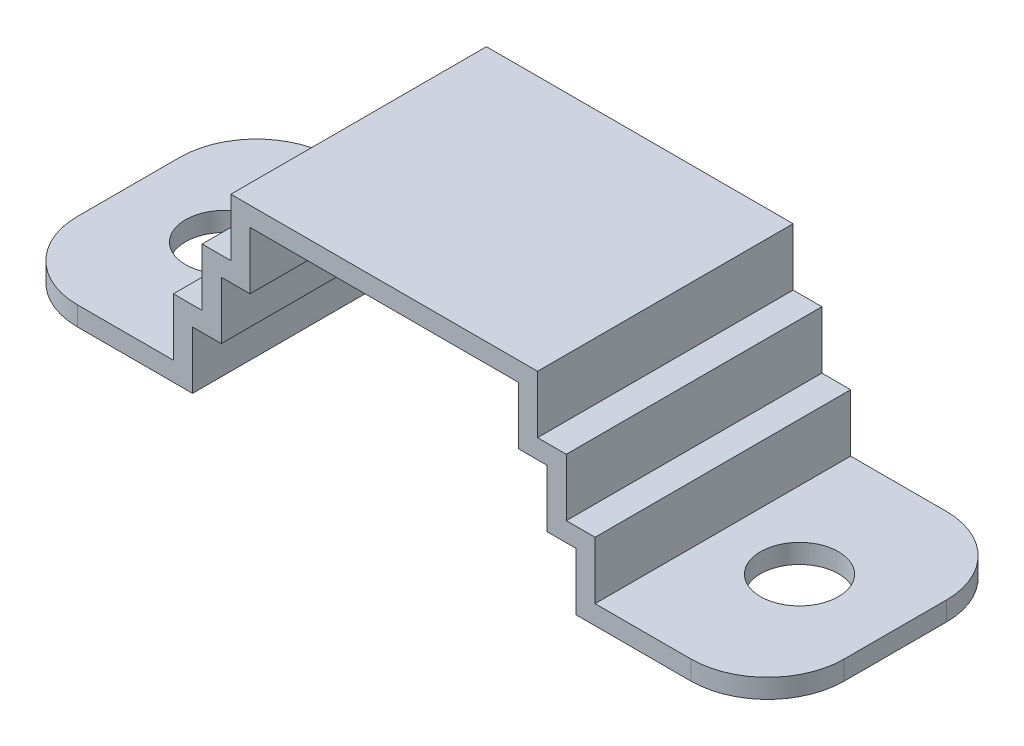
ISO-10303-21;
HEADER;
FILE_DESCRIPTION(('STEP AP214'),'2;1');
FILE_NAME('part.step','',(''),(''),'','','');
FILE_SCHEMA(('AUTOMOTIVE_DESIGN { 1 0 10303 214 1 1 1 1 }'));
ENDSEC;
DATA;
#1=APPLICATION_CONTEXT('core data for automotive mechanical design processes');
#2=APPLICATION_PROTOCOL_DEFINITION('international standard','automotive_design',2000,#1);
#3=PRODUCT_CONTEXT('',#1,'mechanical');
#4=PRODUCT('Part','Part','',(#3));
#5=PRODUCT_RELATED_PRODUCT_CATEGORY('part','',(#4));
#6=PRODUCT_DEFINITION_FORMATION('','',#4);
#7=PRODUCT_DEFINITION_CONTEXT('part definition',#1,'design');
#8=PRODUCT_DEFINITION('design','',#6,#7);
#9=PRODUCT_DEFINITION_SHAPE('','',#8);
#10=(LENGTH_UNIT() NAMED_UNIT(*) SI_UNIT(.MILLI.,.METRE.));
#11=(NAMED_UNIT(*) PLANE_ANGLE_UNIT() SI_UNIT($,.RADIAN.));
#12=(NAMED_UNIT(*) SI_UNIT($,.STERADIAN.) SOLID_ANGLE_UNIT());
#13=UNCERTAINTY_MEASURE_WITH_UNIT(LENGTH_MEASURE(1.E-05),#10,'distance_accuracy_value','');
#14=(GEOMETRIC_REPRESENTATION_CONTEXT(3) GLOBAL_UNCERTAINTY_ASSIGNED_CONTEXT((#13)) GLOBAL_UNIT_ASSIGNED_CONTEXT((#10,
#11,#12)) REPRESENTATION_CONTEXT('',''));
#15=CARTESIAN_POINT('',(0.,0.,0.));
#16=DIRECTION('',(0.,0.,1.));
#17=DIRECTION('',(1.,0.,0.));
#18=AXIS2_PLACEMENT_3D('',#15,#16,#17);
#19=CARTESIAN_POINT('',(-21.,27.,-20.));
#20=DIRECTION('',(0.,-1.,0.));
#21=DIRECTION('',(0.,0.,-1.));
#22=AXIS2_PLACEMENT_3D('',#19,#20,#21);
#23=PLANE('',#22);
#24=DIRECTION('',(1.,0.,0.));
#25=VECTOR('',#24,1.);
#26=CARTESIAN_POINT('',(-21.,27.,20.));
#27=LINE('',#26,#25);
#28=CARTESIAN_POINT('',(-21.,27.,20.));
#29=VERTEX_POINT('',#28);
#30=CARTESIAN_POINT('',(21.,27.,20.));
#31=VERTEX_POINT('',#30);
#32=EDGE_CURVE('E338',#29,#31,#27,.T.);
#33=ORIENTED_EDGE('',*,*,#32,.F.);
#34=DIRECTION('',(0.,0.,1.));
#35=VECTOR('',#34,1.);
#36=CARTESIAN_POINT('',(-21.,27.,-20.));
#37=LINE('',#36,#35);
#38=CARTESIAN_POINT('',(-21.,27.,-20.));
#39=VERTEX_POINT('',#38);
#40=EDGE_CURVE('E258',#39,#29,#37,.T.);
#41=ORIENTED_EDGE('',*,*,#40,.F.);
#42=DIRECTION('',(1.,0.,0.));
#43=VECTOR('',#42,1.);
#44=CARTESIAN_POINT('',(-21.,27.,-20.));
#45=LINE('',#44,#43);
#46=CARTESIAN_POINT('',(21.,27.,-20.));
#47=VERTEX_POINT('',#46);
#48=EDGE_CURVE('E253',#39,#47,#45,.T.);
#49=ORIENTED_EDGE('',*,*,#48,.T.);
#50=DIRECTION('',(0.,0.,1.));
#51=VECTOR('',#50,1.);
#52=CARTESIAN_POINT('',(21.,27.,-20.));
#53=LINE('',#52,#51);
#54=EDGE_CURVE('E257',#47,#31,#53,.T.);
#55=ORIENTED_EDGE('',*,*,#54,.T.);
#56=EDGE_LOOP('',(#33,#41,#49,#55));
#57=FACE_BOUND('',#56,.T.);
#58=ADVANCED_FACE('F42',(#57),#23,.T.);
#59=CARTESIAN_POINT('',(-21.,18.,-20.));
#60=DIRECTION('',(1.,0.,0.));
#61=DIRECTION('',(0.,0.,-1.));
#62=AXIS2_PLACEMENT_3D('',#59,#60,#61);
#63=PLANE('',#62);
#64=DIRECTION('',(0.,1.,0.));
#65=VECTOR('',#64,1.);
#66=CARTESIAN_POINT('',(-21.,18.,20.));
#67=LINE('',#66,#65);
#68=CARTESIAN_POINT('',(-21.,18.,20.));
#69=VERTEX_POINT('',#68);
#70=EDGE_CURVE('E264',#69,#29,#67,.T.);
#71=ORIENTED_EDGE('',*,*,#70,.F.);
#72=DIRECTION('',(0.,0.,1.));
#73=VECTOR('',#72,1.);
#74=CARTESIAN_POINT('',(-21.,18.,-20.));
#75=LINE('',#74,#73);
#76=CARTESIAN_POINT('',(-21.,18.,-20.));
#77=VERTEX_POINT('',#76);
#78=EDGE_CURVE('E388',#77,#69,#75,.T.);
#79=ORIENTED_EDGE('',*,*,#78,.F.);
#80=DIRECTION('',(0.,1.,0.));
#81=VECTOR('',#80,1.);
#82=CARTESIAN_POINT('',(-21.,18.,-20.));
#83=LINE('',#82,#81);
#84=EDGE_CURVE('E334',#77,#39,#83,.T.);
#85=ORIENTED_EDGE('',*,*,#84,.T.);
#86=ORIENTED_EDGE('',*,*,#40,.T.);
#87=EDGE_LOOP('',(#71,#79,#85,#86));
#88=FACE_BOUND('',#87,.T.);
#89=ADVANCED_FACE('F694',(#88),#63,.T.);
#90=CARTESIAN_POINT('',(-25.5,18.,-20.));
#91=DIRECTION('',(0.,-1.,0.));
#92=DIRECTION('',(0.,0.,-1.));
#93=AXIS2_PLACEMENT_3D('',#90,#91,#92);
#94=PLANE('',#93);
#95=DIRECTION('',(1.,0.,0.));
#96=VECTOR('',#95,1.);
#97=CARTESIAN_POINT('',(-25.5,18.,20.));
#98=LINE('',#97,#96);
#99=CARTESIAN_POINT('',(-25.5,18.,20.));
#100=VERTEX_POINT('',#99);
#101=EDGE_CURVE('E378',#100,#69,#98,.T.);
#102=ORIENTED_EDGE('',*,*,#101,.F.);
#103=DIRECTION('',(0.,0.,1.));
#104=VECTOR('',#103,1.);
#105=CARTESIAN_POINT('',(-25.5,18.,-20.));
#106=LINE('',#105,#104);
#107=CARTESIAN_POINT('',(-25.5,18.,-20.));
#108=VERTEX_POINT('',#107);
#109=EDGE_CURVE('E391',#108,#100,#106,.T.);
#110=ORIENTED_EDGE('',*,*,#109,.F.);
#111=DIRECTION('',(1.,0.,0.));
#112=VECTOR('',#111,1.);
#113=CARTESIAN_POINT('',(-25.5,18.,-20.));
#114=LINE('',#113,#112);
#115=EDGE_CURVE('E330',#108,#77,#114,.T.);
#116=ORIENTED_EDGE('',*,*,#115,.T.);
#117=ORIENTED_EDGE('',*,*,#78,.T.);
#118=EDGE_LOOP('',(#102,#110,#116,#117));
#119=FACE_BOUND('',#118,.T.);
#120=ADVANCED_FACE('F691',(#119),#94,.T.);
#121=CARTESIAN_POINT('',(-25.5,9.,-20.));
#122=DIRECTION('',(1.,0.,0.));
#123=DIRECTION('',(0.,0.,-1.));
#124=AXIS2_PLACEMENT_3D('',#121,#122,#123);
#125=PLANE('',#124);
#126=DIRECTION('',(0.,1.,0.));
#127=VECTOR('',#126,1.);
#128=CARTESIAN_POINT('',(-25.5,9.,20.));
#129=LINE('',#128,#127);
#130=CARTESIAN_POINT('',(-25.5,9.,20.));
#131=VERTEX_POINT('',#130);
#132=EDGE_CURVE('E374',#131,#100,#129,.T.);
#133=ORIENTED_EDGE('',*,*,#132,.F.);
#134=DIRECTION('',(0.,0.,1.));
#135=VECTOR('',#134,1.);
#136=CARTESIAN_POINT('',(-25.5,9.,-20.));
#137=LINE('',#136,#135);
#138=CARTESIAN_POINT('',(-25.5,9.,-20.));
#139=VERTEX_POINT('',#138);
#140=EDGE_CURVE('E394',#139,#131,#137,.T.);
#141=ORIENTED_EDGE('',*,*,#140,.F.);
#142=DIRECTION('',(0.,1.,0.));
#143=VECTOR('',#142,1.);
#144=CARTESIAN_POINT('',(-25.5,9.,-20.));
#145=LINE('',#144,#143);
#146=EDGE_CURVE('E326',#139,#108,#145,.T.);
#147=ORIENTED_EDGE('',*,*,#146,.T.);
#148=ORIENTED_EDGE('',*,*,#109,.T.);
#149=EDGE_LOOP('',(#133,#141,#147,#148));
#150=FACE_BOUND('',#149,.T.);
#151=ADVANCED_FACE('F687',(#150),#125,.T.);
#152=CARTESIAN_POINT('',(-30.,9.,-20.));
#153=DIRECTION('',(0.,-1.,0.));
#154=DIRECTION('',(0.,0.,-1.));
#155=AXIS2_PLACEMENT_3D('',#152,#153,#154);
#156=PLANE('',#155);
#157=DIRECTION('',(1.,0.,0.));
#158=VECTOR('',#157,1.);
#159=CARTESIAN_POINT('',(-30.,9.,20.));
#160=LINE('',#159,#158);
#161=CARTESIAN_POINT('',(-30.,9.,20.));
#162=VERTEX_POINT('',#161);
#163=EDGE_CURVE('E370',#162,#131,#160,.T.);
#164=ORIENTED_EDGE('',*,*,#163,.F.);
#165=DIRECTION('',(0.,0.,1.));
#166=VECTOR('',#165,1.);
#167=CARTESIAN_POINT('',(-30.,9.,-20.));
#168=LINE('',#167,#166);
#169=CARTESIAN_POINT('',(-30.,9.,-20.));
#170=VERTEX_POINT('',#169);
#171=EDGE_CURVE('E397',#170,#162,#168,.T.);
#172=ORIENTED_EDGE('',*,*,#171,.F.);
#173=DIRECTION('',(1.,0.,0.));
#174=VECTOR('',#173,1.);
#175=CARTESIAN_POINT('',(-30.,9.,-20.));
#176=LINE('',#175,#174);
#177=EDGE_CURVE('E322',#170,#139,#176,.T.);
#178=ORIENTED_EDGE('',*,*,#177,.T.);
#179=ORIENTED_EDGE('',*,*,#140,.T.);
#180=EDGE_LOOP('',(#164,#172,#178,#179));
#181=FACE_BOUND('',#180,.T.);
#182=ADVANCED_FACE('F684',(#181),#156,.T.);
#183=CARTESIAN_POINT('',(-30.,0.,-20.));
#184=DIRECTION('',(1.,0.,0.));
#185=DIRECTION('',(0.,0.,-1.));
#186=AXIS2_PLACEMENT_3D('',#183,#184,#185);
#187=PLANE('',#186);
#188=DIRECTION('',(0.,1.,0.));
#189=VECTOR('',#188,1.);
#190=CARTESIAN_POINT('',(-30.,0.,20.));
#191=LINE('',#190,#189);
#192=CARTESIAN_POINT('',(-30.,0.,20.));
#193=VERTEX_POINT('',#192);
#194=EDGE_CURVE('E366',#193,#162,#191,.T.);
#195=ORIENTED_EDGE('',*,*,#194,.F.);
#196=DIRECTION('',(0.,0.,1.));
#197=VECTOR('',#196,1.);
#198=CARTESIAN_POINT('',(-30.,0.,-20.));
#199=LINE('',#198,#197);
#200=CARTESIAN_POINT('',(-30.,0.,-20.));
#201=VERTEX_POINT('',#200);
#202=EDGE_CURVE('E400',#201,#193,#199,.T.);
#203=ORIENTED_EDGE('',*,*,#202,.F.);
#204=DIRECTION('',(0.,1.,0.));
#205=VECTOR('',#204,1.);
#206=CARTESIAN_POINT('',(-30.,0.,-20.));
#207=LINE('',#206,#205);
#208=EDGE_CURVE('E318',#201,#170,#207,.T.);
#209=ORIENTED_EDGE('',*,*,#208,.T.);
#210=ORIENTED_EDGE('',*,*,#171,.T.);
#211=EDGE_LOOP('',(#195,#203,#209,#210));
#212=FACE_BOUND('',#211,.T.);
#213=ADVANCED_FACE('F680',(#212),#187,.T.);
#214=CARTESIAN_POINT('',(-60.,0.,-20.));
#215=DIRECTION('',(0.,-1.,0.));
#216=DIRECTION('',(0.,0.,-1.));
#217=AXIS2_PLACEMENT_3D('',#214,#215,#216);
#218=PLANE('',#217);
#219=CARTESIAN_POINT('',(-45.,0.,0.));
#220=DIRECTION('',(0.,1.,0.));
#221=DIRECTION('',(0.,0.,1.));
#222=AXIS2_PLACEMENT_3D('',#219,#220,#221);
#223=CIRCLE('',#222,6.1);
#224=CARTESIAN_POINT('',(-45.,0.,6.1));
#225=VERTEX_POINT('',#224);
#226=EDGE_CURVE('E541',#225,#225,#223,.T.);
#227=ORIENTED_EDGE('',*,*,#226,.T.);
#228=EDGE_LOOP('',(#227));
#229=FACE_BOUND('',#228,.T.);
#230=DIRECTION('',(0.,0.,1.));
#231=VECTOR('',#230,1.);
#232=CARTESIAN_POINT('',(-60.,0.,-20.));
#233=LINE('',#232,#231);
#234=CARTESIAN_POINT('',(-60.,0.,-8.));
#235=VERTEX_POINT('',#234);
#236=CARTESIAN_POINT('',(-60.,0.,8.));
#237=VERTEX_POINT('',#236);
#238=EDGE_CURVE('E404',#235,#237,#233,.T.);
#239=ORIENTED_EDGE('',*,*,#238,.F.);
#240=CARTESIAN_POINT('',(-48.,0.,-8.));
#241=DIRECTION('',(0.,-1.,0.));
#242=DIRECTION('',(0.,0.,-1.));
#243=AXIS2_PLACEMENT_3D('',#240,#241,#242);
#244=CIRCLE('',#243,12.);
#245=CARTESIAN_POINT('',(-48.,0.,-20.));
#246=VERTEX_POINT('',#245);
#247=EDGE_CURVE('E457',#235,#246,#244,.T.);
#248=ORIENTED_EDGE('',*,*,#247,.T.);
#249=DIRECTION('',(1.,0.,0.));
#250=VECTOR('',#249,1.);
#251=CARTESIAN_POINT('',(-60.,0.,-20.));
#252=LINE('',#251,#250);
#253=EDGE_CURVE('E315',#246,#201,#252,.T.);
#254=ORIENTED_EDGE('',*,*,#253,.T.);
#255=ORIENTED_EDGE('',*,*,#202,.T.);
#256=DIRECTION('',(1.,0.,0.));
#257=VECTOR('',#256,1.);
#258=CARTESIAN_POINT('',(-60.,0.,20.));
#259=LINE('',#258,#257);
#260=CARTESIAN_POINT('',(-48.,0.,20.));
#261=VERTEX_POINT('',#260);
#262=EDGE_CURVE('E363',#261,#193,#259,.T.);
#263=ORIENTED_EDGE('',*,*,#262,.F.);
#264=CARTESIAN_POINT('',(-48.,0.,8.));
#265=DIRECTION('',(0.,-1.,0.));
#266=DIRECTION('',(0.,0.,-1.));
#267=AXIS2_PLACEMENT_3D('',#264,#265,#266);
#268=CIRCLE('',#267,12.);
#269=EDGE_CURVE('E454',#261,#237,#268,.T.);
#270=ORIENTED_EDGE('',*,*,#269,.T.);
#271=EDGE_LOOP('',(#239,#248,#254,#255,#263,#270));
#272=FACE_BOUND('',#271,.T.);
#273=ADVANCED_FACE('F670',(#229,#272),#218,.T.);
#274=CARTESIAN_POINT('',(-60.,0.,-20.));
#275=DIRECTION('',(1.,0.,0.));
#276=DIRECTION('',(0.,0.,-1.));
#277=AXIS2_PLACEMENT_3D('',#274,#275,#276);
#278=PLANE('',#277);
#279=DIRECTION('',(0.,0.,1.));
#280=VECTOR('',#279,1.);
#281=CARTESIAN_POINT('',(-60.,3.,-20.));
#282=LINE('',#281,#280);
#283=CARTESIAN_POINT('',(-60.,3.,-8.));
#284=VERTEX_POINT('',#283);
#285=CARTESIAN_POINT('',(-60.,3.,8.));
#286=VERTEX_POINT('',#285);
#287=EDGE_CURVE('E408',#284,#286,#282,.T.);
#288=ORIENTED_EDGE('',*,*,#287,.F.);
#289=DIRECTION('',(0.,1.,0.));
#290=VECTOR('',#289,1.);
#291=CARTESIAN_POINT('',(-60.,0.,-8.));
#292=LINE('',#291,#290);
#293=EDGE_CURVE('E451',#284,#235,#292,.F.);
#294=ORIENTED_EDGE('',*,*,#293,.T.);
#295=ORIENTED_EDGE('',*,*,#238,.T.);
#296=DIRECTION('',(0.,1.,0.));
#297=VECTOR('',#296,1.);
#298=CARTESIAN_POINT('',(-60.,0.,8.));
#299=LINE('',#298,#297);
#300=EDGE_CURVE('E447',#237,#286,#299,.T.);
#301=ORIENTED_EDGE('',*,*,#300,.T.);
#302=EDGE_LOOP('',(#288,#294,#295,#301));
#303=FACE_BOUND('',#302,.T.);
#304=ADVANCED_FACE('F665',(#303),#278,.F.);
#305=CARTESIAN_POINT('',(-60.,3.,-20.));
#306=DIRECTION('',(0.,-1.,0.));
#307=DIRECTION('',(0.,0.,-1.));
#308=AXIS2_PLACEMENT_3D('',#305,#306,#307);
#309=PLANE('',#308);
#310=CARTESIAN_POINT('',(-45.,3.,0.));
#311=DIRECTION('',(0.,1.,0.));
#312=DIRECTION('',(0.,0.,1.));
#313=AXIS2_PLACEMENT_3D('',#310,#311,#312);
#314=CIRCLE('',#313,6.1);
#315=CARTESIAN_POINT('',(-45.,3.,6.1));
#316=VERTEX_POINT('',#315);
#317=EDGE_CURVE('E756',#316,#316,#314,.T.);
#318=ORIENTED_EDGE('',*,*,#317,.F.);
#319=EDGE_LOOP('',(#318));
#320=FACE_BOUND('',#319,.T.);
#321=DIRECTION('',(1.,0.,0.));
#322=VECTOR('',#321,1.);
#323=CARTESIAN_POINT('',(-60.,3.,-20.));
#324=LINE('',#323,#322);
#325=CARTESIAN_POINT('',(-48.,3.,-20.));
#326=VERTEX_POINT('',#325);
#327=CARTESIAN_POINT('',(-33.,3.,-20.));
#328=VERTEX_POINT('',#327);
#329=EDGE_CURVE('E312',#326,#328,#324,.T.);
#330=ORIENTED_EDGE('',*,*,#329,.F.);
#331=CARTESIAN_POINT('',(-48.,3.,-8.));
#332=DIRECTION('',(0.,-1.,0.));
#333=DIRECTION('',(0.,0.,-1.));
#334=AXIS2_PLACEMENT_3D('',#331,#332,#333);
#335=CIRCLE('',#334,12.);
#336=EDGE_CURVE('E444',#326,#284,#335,.F.);
#337=ORIENTED_EDGE('',*,*,#336,.T.);
#338=ORIENTED_EDGE('',*,*,#287,.T.);
#339=CARTESIAN_POINT('',(-48.,3.,8.));
#340=DIRECTION('',(0.,-1.,0.));
#341=DIRECTION('',(0.,0.,-1.));
#342=AXIS2_PLACEMENT_3D('',#339,#340,#341);
#343=CIRCLE('',#342,12.);
#344=CARTESIAN_POINT('',(-48.,3.,20.));
#345=VERTEX_POINT('',#344);
#346=EDGE_CURVE('E441',#286,#345,#343,.F.);
#347=ORIENTED_EDGE('',*,*,#346,.T.);
#348=DIRECTION('',(1.,0.,0.));
#349=VECTOR('',#348,1.);
#350=CARTESIAN_POINT('',(-60.,3.,20.));
#351=LINE('',#350,#349);
#352=CARTESIAN_POINT('',(-33.,3.,20.));
#353=VERTEX_POINT('',#352);
#354=EDGE_CURVE('E360',#345,#353,#351,.T.);
#355=ORIENTED_EDGE('',*,*,#354,.T.);
#356=DIRECTION('',(0.,0.,1.));
#357=VECTOR('',#356,1.);
#358=CARTESIAN_POINT('',(-33.,3.,-20.));
#359=LINE('',#358,#357);
#360=EDGE_CURVE('E412',#328,#353,#359,.T.);
#361=ORIENTED_EDGE('',*,*,#360,.F.);
#362=EDGE_LOOP('',(#330,#337,#338,#347,#355,#361));
#363=FACE_BOUND('',#362,.T.);
#364=ADVANCED_FACE('F658',(#320,#363),#309,.F.);
#365=CARTESIAN_POINT('',(-33.,0.,-20.));
#366=DIRECTION('',(1.,0.,0.));
#367=DIRECTION('',(0.,0.,-1.));
#368=AXIS2_PLACEMENT_3D('',#365,#366,#367);
#369=PLANE('',#368);
#370=DIRECTION('',(0.,1.,0.));
#371=VECTOR('',#370,1.);
#372=CARTESIAN_POINT('',(-33.,0.,20.));
#373=LINE('',#372,#371);
#374=CARTESIAN_POINT('',(-33.,12.,20.));
#375=VERTEX_POINT('',#374);
#376=EDGE_CURVE('E357',#353,#375,#373,.T.);
#377=ORIENTED_EDGE('',*,*,#376,.T.);
#378=DIRECTION('',(0.,0.,1.));
#379=VECTOR('',#378,1.);
#380=CARTESIAN_POINT('',(-33.,12.,-20.));
#381=LINE('',#380,#379);
#382=CARTESIAN_POINT('',(-33.,12.,-20.));
#383=VERTEX_POINT('',#382);
#384=EDGE_CURVE('E416',#383,#375,#381,.T.);
#385=ORIENTED_EDGE('',*,*,#384,.F.);
#386=DIRECTION('',(0.,1.,0.));
#387=VECTOR('',#386,1.);
#388=CARTESIAN_POINT('',(-33.,0.,-20.));
#389=LINE('',#388,#387);
#390=EDGE_CURVE('E309',#328,#383,#389,.T.);
#391=ORIENTED_EDGE('',*,*,#390,.F.);
#392=ORIENTED_EDGE('',*,*,#360,.T.);
#393=EDGE_LOOP('',(#377,#385,#391,#392));
#394=FACE_BOUND('',#393,.T.);
#395=ADVANCED_FACE('F653',(#394),#369,.F.);
#396=CARTESIAN_POINT('',(-30.,12.,-20.));
#397=DIRECTION('',(0.,-1.,0.));
#398=DIRECTION('',(0.,0.,-1.));
#399=AXIS2_PLACEMENT_3D('',#396,#397,#398);
#400=PLANE('',#399);
#401=DIRECTION('',(1.,0.,0.));
#402=VECTOR('',#401,1.);
#403=CARTESIAN_POINT('',(-30.,12.,20.));
#404=LINE('',#403,#402);
#405=CARTESIAN_POINT('',(-28.5,12.,20.));
#406=VERTEX_POINT('',#405);
#407=EDGE_CURVE('E354',#375,#406,#404,.T.);
#408=ORIENTED_EDGE('',*,*,#407,.T.);
#409=DIRECTION('',(0.,0.,1.));
#410=VECTOR('',#409,1.);
#411=CARTESIAN_POINT('',(-28.5,12.,-20.));
#412=LINE('',#411,#410);
#413=CARTESIAN_POINT('',(-28.5,12.,-20.));
#414=VERTEX_POINT('',#413);
#415=EDGE_CURVE('E420',#414,#406,#412,.T.);
#416=ORIENTED_EDGE('',*,*,#415,.F.);
#417=DIRECTION('',(1.,0.,0.));
#418=VECTOR('',#417,1.);
#419=CARTESIAN_POINT('',(-30.,12.,-20.));
#420=LINE('',#419,#418);
#421=EDGE_CURVE('E306',#383,#414,#420,.T.);
#422=ORIENTED_EDGE('',*,*,#421,.F.);
#423=ORIENTED_EDGE('',*,*,#384,.T.);
#424=EDGE_LOOP('',(#408,#416,#422,#423));
#425=FACE_BOUND('',#424,.T.);
#426=ADVANCED_FACE('F648',(#425),#400,.F.);
#427=CARTESIAN_POINT('',(-28.5,9.,-20.));
#428=DIRECTION('',(1.,0.,0.));
#429=DIRECTION('',(0.,0.,-1.));
#430=AXIS2_PLACEMENT_3D('',#427,#428,#429);
#431=PLANE('',#430);
#432=DIRECTION('',(0.,1.,0.));
#433=VECTOR('',#432,1.);
#434=CARTESIAN_POINT('',(-28.5,9.,20.));
#435=LINE('',#434,#433);
#436=CARTESIAN_POINT('',(-28.5,21.,20.));
#437=VERTEX_POINT('',#436);
#438=EDGE_CURVE('E351',#406,#437,#435,.T.);
#439=ORIENTED_EDGE('',*,*,#438,.T.);
#440=DIRECTION('',(0.,0.,1.));
#441=VECTOR('',#440,1.);
#442=CARTESIAN_POINT('',(-28.5,21.,-20.));
#443=LINE('',#442,#441);
#444=CARTESIAN_POINT('',(-28.5,21.,-20.));
#445=VERTEX_POINT('',#444);
#446=EDGE_CURVE('E424',#445,#437,#443,.T.);
#447=ORIENTED_EDGE('',*,*,#446,.F.);
#448=DIRECTION('',(0.,1.,0.));
#449=VECTOR('',#448,1.);
#450=CARTESIAN_POINT('',(-28.5,9.,-20.));
#451=LINE('',#450,#449);
#452=EDGE_CURVE('E303',#414,#445,#451,.T.);
#453=ORIENTED_EDGE('',*,*,#452,.F.);
#454=ORIENTED_EDGE('',*,*,#415,.T.);
#455=EDGE_LOOP('',(#439,#447,#453,#454));
#456=FACE_BOUND('',#455,.T.);
#457=ADVANCED_FACE('F644',(#456),#431,.F.);
#458=CARTESIAN_POINT('',(-25.5,21.,-20.));
#459=DIRECTION('',(0.,-1.,0.));
#460=DIRECTION('',(0.,0.,-1.));
#461=AXIS2_PLACEMENT_3D('',#458,#459,#460);
#462=PLANE('',#461);
#463=DIRECTION('',(1.,0.,0.));
#464=VECTOR('',#463,1.);
#465=CARTESIAN_POINT('',(-25.5,21.,20.));
#466=LINE('',#465,#464);
#467=CARTESIAN_POINT('',(-24.,21.,20.));
#468=VERTEX_POINT('',#467);
#469=EDGE_CURVE('E348',#437,#468,#466,.T.);
#470=ORIENTED_EDGE('',*,*,#469,.T.);
#471=DIRECTION('',(0.,0.,1.));
#472=VECTOR('',#471,1.);
#473=CARTESIAN_POINT('',(-24.,21.,-20.));
#474=LINE('',#473,#472);
#475=CARTESIAN_POINT('',(-24.,21.,-20.));
#476=VERTEX_POINT('',#475);
#477=EDGE_CURVE('E428',#476,#468,#474,.T.);
#478=ORIENTED_EDGE('',*,*,#477,.F.);
#479=DIRECTION('',(1.,0.,0.));
#480=VECTOR('',#479,1.);
#481=CARTESIAN_POINT('',(-25.5,21.,-20.));
#482=LINE('',#481,#480);
#483=EDGE_CURVE('E300',#445,#476,#482,.T.);
#484=ORIENTED_EDGE('',*,*,#483,.F.);
#485=ORIENTED_EDGE('',*,*,#446,.T.);
#486=EDGE_LOOP('',(#470,#478,#484,#485));
#487=FACE_BOUND('',#486,.T.);
#488=ADVANCED_FACE('F639',(#487),#462,.F.);
#489=CARTESIAN_POINT('',(-24.,18.,-20.));
#490=DIRECTION('',(1.,0.,0.));
#491=DIRECTION('',(0.,0.,-1.));
#492=AXIS2_PLACEMENT_3D('',#489,#490,#491);
#493=PLANE('',#492);
#494=DIRECTION('',(0.,1.,0.));
#495=VECTOR('',#494,1.);
#496=CARTESIAN_POINT('',(-24.,18.,20.));
#497=LINE('',#496,#495);
#498=CARTESIAN_POINT('',(-24.,30.,20.));
#499=VERTEX_POINT('',#498);
#500=EDGE_CURVE('E345',#468,#499,#497,.T.);
#501=ORIENTED_EDGE('',*,*,#500,.T.);
#502=DIRECTION('',(0.,0.,1.));
#503=VECTOR('',#502,1.);
#504=CARTESIAN_POINT('',(-24.,30.,-20.));
#505=LINE('',#504,#503);
#506=CARTESIAN_POINT('',(-24.,30.,-20.));
#507=VERTEX_POINT('',#506);
#508=EDGE_CURVE('E337',#507,#499,#505,.T.);
#509=ORIENTED_EDGE('',*,*,#508,.F.);
#510=DIRECTION('',(0.,1.,0.));
#511=VECTOR('',#510,1.);
#512=CARTESIAN_POINT('',(-24.,18.,-20.));
#513=LINE('',#512,#511);
#514=EDGE_CURVE('E297',#476,#507,#513,.T.);
#515=ORIENTED_EDGE('',*,*,#514,.F.);
#516=ORIENTED_EDGE('',*,*,#477,.T.);
#517=EDGE_LOOP('',(#501,#509,#515,#516));
#518=FACE_BOUND('',#517,.T.);
#519=ADVANCED_FACE('F633',(#518),#493,.F.);
#520=CARTESIAN_POINT('',(-21.,30.,-20.));
#521=DIRECTION('',(0.,-1.,0.));
#522=DIRECTION('',(0.,0.,-1.));
#523=AXIS2_PLACEMENT_3D('',#520,#521,#522);
#524=PLANE('',#523);
#525=DIRECTION('',(1.,0.,0.));
#526=VECTOR('',#525,1.);
#527=CARTESIAN_POINT('',(-21.,30.,20.));
#528=LINE('',#527,#526);
#529=CARTESIAN_POINT('',(24.,30.,20.));
#530=VERTEX_POINT('',#529);
#531=EDGE_CURVE('E341',#499,#530,#528,.T.);
#532=ORIENTED_EDGE('',*,*,#531,.T.);
#533=DIRECTION('',(0.,0.,1.));
#534=VECTOR('',#533,1.);
#535=CARTESIAN_POINT('',(24.,30.,-20.));
#536=LINE('',#535,#534);
#537=CARTESIAN_POINT('',(24.,30.,-20.));
#538=VERTEX_POINT('',#537);
#539=EDGE_CURVE('E342',#538,#530,#536,.T.);
#540=ORIENTED_EDGE('',*,*,#539,.F.);
#541=DIRECTION('',(1.,0.,0.));
#542=VECTOR('',#541,1.);
#543=CARTESIAN_POINT('',(-21.,30.,-20.));
#544=LINE('',#543,#542);
#545=EDGE_CURVE('E263',#507,#538,#544,.T.);
#546=ORIENTED_EDGE('',*,*,#545,.F.);
#547=ORIENTED_EDGE('',*,*,#508,.T.);
#548=EDGE_LOOP('',(#532,#540,#546,#547));
#549=FACE_BOUND('',#548,.T.);
#550=ADVANCED_FACE('F629',(#549),#524,.F.);
#551=CARTESIAN_POINT('',(0.,0.,-20.));
#552=DIRECTION('',(0.,0.,-1.));
#553=DIRECTION('',(-1.,0.,0.));
#554=AXIS2_PLACEMENT_3D('',#551,#552,#553);
#555=PLANE('',#554);
#556=ORIENTED_EDGE('',*,*,#253,.F.);
#557=DIRECTION('',(0.,1.,0.));
#558=VECTOR('',#557,1.);
#559=CARTESIAN_POINT('',(-48.,3.,-20.));
#560=LINE('',#559,#558);
#561=EDGE_CURVE('E437',#246,#326,#560,.T.);
#562=ORIENTED_EDGE('',*,*,#561,.T.);
#563=ORIENTED_EDGE('',*,*,#329,.T.);
#564=ORIENTED_EDGE('',*,*,#390,.T.);
#565=ORIENTED_EDGE('',*,*,#421,.T.);
#566=ORIENTED_EDGE('',*,*,#452,.T.);
#567=ORIENTED_EDGE('',*,*,#483,.T.);
#568=ORIENTED_EDGE('',*,*,#514,.T.);
#569=ORIENTED_EDGE('',*,*,#545,.T.);
#570=DIRECTION('',(0.,1.,0.));
#571=VECTOR('',#570,1.);
#572=CARTESIAN_POINT('',(24.,18.,-20.));
#573=LINE('',#572,#571);
#574=CARTESIAN_POINT('',(24.,21.,-20.));
#575=VERTEX_POINT('',#574);
#576=EDGE_CURVE('E284',#575,#538,#573,.T.);
#577=ORIENTED_EDGE('',*,*,#576,.F.);
#578=DIRECTION('',(-1.,0.,0.));
#579=VECTOR('',#578,1.);
#580=CARTESIAN_POINT('',(25.5,21.,-20.));
#581=LINE('',#580,#579);
#582=CARTESIAN_POINT('',(28.5,21.,-20.));
#583=VERTEX_POINT('',#582);
#584=EDGE_CURVE('E291',#583,#575,#581,.T.);
#585=ORIENTED_EDGE('',*,*,#584,.F.);
#586=DIRECTION('',(0.,1.,0.));
#587=VECTOR('',#586,1.);
#588=CARTESIAN_POINT('',(28.5,9.,-20.));
#589=LINE('',#588,#587);
#590=CARTESIAN_POINT('',(28.5,12.,-20.));
#591=VERTEX_POINT('',#590);
#592=EDGE_CURVE('E603',#591,#583,#589,.T.);
#593=ORIENTED_EDGE('',*,*,#592,.F.);
#594=DIRECTION('',(-1.,0.,0.));
#595=VECTOR('',#594,1.);
#596=CARTESIAN_POINT('',(30.,12.,-20.));
#597=LINE('',#596,#595);
#598=CARTESIAN_POINT('',(33.,12.,-20.));
#599=VERTEX_POINT('',#598);
#600=EDGE_CURVE('E598',#599,#591,#597,.T.);
#601=ORIENTED_EDGE('',*,*,#600,.F.);
#602=DIRECTION('',(0.,1.,0.));
#603=VECTOR('',#602,1.);
#604=CARTESIAN_POINT('',(33.,0.,-20.));
#605=LINE('',#604,#603);
#606=CARTESIAN_POINT('',(33.,3.,-20.));
#607=VERTEX_POINT('',#606);
#608=EDGE_CURVE('E588',#607,#599,#605,.T.);
#609=ORIENTED_EDGE('',*,*,#608,.F.);
#610=DIRECTION('',(-1.,0.,0.));
#611=VECTOR('',#610,1.);
#612=CARTESIAN_POINT('',(60.,3.,-20.));
#613=LINE('',#612,#611);
#614=CARTESIAN_POINT('',(48.,3.,-20.));
#615=VERTEX_POINT('',#614);
#616=EDGE_CURVE('E596',#615,#607,#613,.T.);
#617=ORIENTED_EDGE('',*,*,#616,.F.);
#618=DIRECTION('',(0.,1.,0.));
#619=VECTOR('',#618,1.);
#620=CARTESIAN_POINT('',(48.,0.,-20.));
#621=LINE('',#620,#619);
#622=CARTESIAN_POINT('',(48.,0.,-20.));
#623=VERTEX_POINT('',#622);
#624=EDGE_CURVE('E387',#615,#623,#621,.F.);
#625=ORIENTED_EDGE('',*,*,#624,.T.);
#626=DIRECTION('',(-1.,0.,0.));
#627=VECTOR('',#626,1.);
#628=CARTESIAN_POINT('',(60.,0.,-20.));
#629=LINE('',#628,#627);
#630=CARTESIAN_POINT('',(30.,0.,-20.));
#631=VERTEX_POINT('',#630);
#632=EDGE_CURVE('E605',#623,#631,#629,.T.);
#633=ORIENTED_EDGE('',*,*,#632,.T.);
#634=DIRECTION('',(0.,1.,0.));
#635=VECTOR('',#634,1.);
#636=CARTESIAN_POINT('',(30.,0.,-20.));
#637=LINE('',#636,#635);
#638=CARTESIAN_POINT('',(30.,9.,-20.));
#639=VERTEX_POINT('',#638);
#640=EDGE_CURVE('E744',#631,#639,#637,.T.);
#641=ORIENTED_EDGE('',*,*,#640,.T.);
#642=DIRECTION('',(-1.,0.,0.));
#643=VECTOR('',#642,1.);
#644=CARTESIAN_POINT('',(30.,9.,-20.));
#645=LINE('',#644,#643);
#646=CARTESIAN_POINT('',(25.5,9.,-20.));
#647=VERTEX_POINT('',#646);
#648=EDGE_CURVE('E746',#639,#647,#645,.T.);
#649=ORIENTED_EDGE('',*,*,#648,.T.);
#650=DIRECTION('',(0.,1.,0.));
#651=VECTOR('',#650,1.);
#652=CARTESIAN_POINT('',(25.5,9.,-20.));
#653=LINE('',#652,#651);
#654=CARTESIAN_POINT('',(25.5,18.,-20.));
#655=VERTEX_POINT('',#654);
#656=EDGE_CURVE('E751',#647,#655,#653,.T.);
#657=ORIENTED_EDGE('',*,*,#656,.T.);
#658=DIRECTION('',(-1.,0.,0.));
#659=VECTOR('',#658,1.);
#660=CARTESIAN_POINT('',(25.5,18.,-20.));
#661=LINE('',#660,#659);
#662=CARTESIAN_POINT('',(21.,18.,-20.));
#663=VERTEX_POINT('',#662);
#664=EDGE_CURVE('E271',#655,#663,#661,.T.);
#665=ORIENTED_EDGE('',*,*,#664,.T.);
#666=DIRECTION('',(0.,1.,0.));
#667=VECTOR('',#666,1.);
#668=CARTESIAN_POINT('',(21.,18.,-20.));
#669=LINE('',#668,#667);
#670=EDGE_CURVE('E267',#663,#47,#669,.T.);
#671=ORIENTED_EDGE('',*,*,#670,.T.);
#672=ORIENTED_EDGE('',*,*,#48,.F.);
#673=ORIENTED_EDGE('',*,*,#84,.F.);
#674=ORIENTED_EDGE('',*,*,#115,.F.);
#675=ORIENTED_EDGE('',*,*,#146,.F.);
#676=ORIENTED_EDGE('',*,*,#177,.F.);
#677=ORIENTED_EDGE('',*,*,#208,.F.);
#678=EDGE_LOOP('',(#556,#562,#563,#564,#565,#566,#567,#568,#569,#577,#585,#593,#601,#609,#617,
#625,#633,#641,#649,#657,#665,#671,#672,#673,#674,#675,#676,#677));
#679=FACE_BOUND('',#678,.T.);
#680=ADVANCED_FACE('F269',(#679),#555,.T.);
#681=CARTESIAN_POINT('',(0.,0.,20.));
#682=DIRECTION('',(0.,0.,-1.));
#683=DIRECTION('',(-1.,0.,0.));
#684=AXIS2_PLACEMENT_3D('',#681,#682,#683);
#685=PLANE('',#684);
#686=ORIENTED_EDGE('',*,*,#354,.F.);
#687=DIRECTION('',(0.,1.,0.));
#688=VECTOR('',#687,1.);
#689=CARTESIAN_POINT('',(-48.,0.,20.));
#690=LINE('',#689,#688);
#691=EDGE_CURVE('E464',#345,#261,#690,.F.);
#692=ORIENTED_EDGE('',*,*,#691,.T.);
#693=ORIENTED_EDGE('',*,*,#262,.T.);
#694=ORIENTED_EDGE('',*,*,#194,.T.);
#695=ORIENTED_EDGE('',*,*,#163,.T.);
#696=ORIENTED_EDGE('',*,*,#132,.T.);
#697=ORIENTED_EDGE('',*,*,#101,.T.);
#698=ORIENTED_EDGE('',*,*,#70,.T.);
#699=ORIENTED_EDGE('',*,*,#32,.T.);
#700=DIRECTION('',(0.,1.,0.));
#701=VECTOR('',#700,1.);
#702=CARTESIAN_POINT('',(21.,18.,20.));
#703=LINE('',#702,#701);
#704=CARTESIAN_POINT('',(21.,18.,20.));
#705=VERTEX_POINT('',#704);
#706=EDGE_CURVE('E281',#705,#31,#703,.T.);
#707=ORIENTED_EDGE('',*,*,#706,.F.);
#708=DIRECTION('',(-1.,0.,0.));
#709=VECTOR('',#708,1.);
#710=CARTESIAN_POINT('',(25.5,18.,20.));
#711=LINE('',#710,#709);
#712=CARTESIAN_POINT('',(25.5,18.,20.));
#713=VERTEX_POINT('',#712);
#714=EDGE_CURVE('E530',#713,#705,#711,.T.);
#715=ORIENTED_EDGE('',*,*,#714,.F.);
#716=DIRECTION('',(0.,1.,0.));
#717=VECTOR('',#716,1.);
#718=CARTESIAN_POINT('',(25.5,9.,20.));
#719=LINE('',#718,#717);
#720=CARTESIAN_POINT('',(25.5,9.,20.));
#721=VERTEX_POINT('',#720);
#722=EDGE_CURVE('E534',#721,#713,#719,.T.);
#723=ORIENTED_EDGE('',*,*,#722,.F.);
#724=DIRECTION('',(-1.,0.,0.));
#725=VECTOR('',#724,1.);
#726=CARTESIAN_POINT('',(30.,9.,20.));
#727=LINE('',#726,#725);
#728=CARTESIAN_POINT('',(30.,9.,20.));
#729=VERTEX_POINT('',#728);
#730=EDGE_CURVE('E539',#729,#721,#727,.T.);
#731=ORIENTED_EDGE('',*,*,#730,.F.);
#732=DIRECTION('',(0.,1.,0.));
#733=VECTOR('',#732,1.);
#734=CARTESIAN_POINT('',(30.,0.,20.));
#735=LINE('',#734,#733);
#736=CARTESIAN_POINT('',(30.,0.,20.));
#737=VERTEX_POINT('',#736);
#738=EDGE_CURVE('E496',#737,#729,#735,.T.);
#739=ORIENTED_EDGE('',*,*,#738,.F.);
#740=DIRECTION('',(-1.,0.,0.));
#741=VECTOR('',#740,1.);
#742=CARTESIAN_POINT('',(60.,0.,20.));
#743=LINE('',#742,#741);
#744=CARTESIAN_POINT('',(48.,0.,20.));
#745=VERTEX_POINT('',#744);
#746=EDGE_CURVE('E484',#745,#737,#743,.T.);
#747=ORIENTED_EDGE('',*,*,#746,.F.);
#748=DIRECTION('',(0.,1.,0.));
#749=VECTOR('',#748,1.);
#750=CARTESIAN_POINT('',(48.,3.,20.));
#751=LINE('',#750,#749);
#752=CARTESIAN_POINT('',(48.,3.,20.));
#753=VERTEX_POINT('',#752);
#754=EDGE_CURVE('E460',#745,#753,#751,.T.);
#755=ORIENTED_EDGE('',*,*,#754,.T.);
#756=DIRECTION('',(-1.,0.,0.));
#757=VECTOR('',#756,1.);
#758=CARTESIAN_POINT('',(60.,3.,20.));
#759=LINE('',#758,#757);
#760=CARTESIAN_POINT('',(33.,3.,20.));
#761=VERTEX_POINT('',#760);
#762=EDGE_CURVE('E498',#753,#761,#759,.T.);
#763=ORIENTED_EDGE('',*,*,#762,.T.);
#764=DIRECTION('',(0.,1.,0.));
#765=VECTOR('',#764,1.);
#766=CARTESIAN_POINT('',(33.,0.,20.));
#767=LINE('',#766,#765);
#768=CARTESIAN_POINT('',(33.,12.,20.));
#769=VERTEX_POINT('',#768);
#770=EDGE_CURVE('E550',#761,#769,#767,.T.);
#771=ORIENTED_EDGE('',*,*,#770,.T.);
#772=DIRECTION('',(-1.,0.,0.));
#773=VECTOR('',#772,1.);
#774=CARTESIAN_POINT('',(30.,12.,20.));
#775=LINE('',#774,#773);
#776=CARTESIAN_POINT('',(28.5,12.,20.));
#777=VERTEX_POINT('',#776);
#778=EDGE_CURVE('E554',#769,#777,#775,.T.);
#779=ORIENTED_EDGE('',*,*,#778,.T.);
#780=DIRECTION('',(0.,1.,0.));
#781=VECTOR('',#780,1.);
#782=CARTESIAN_POINT('',(28.5,9.,20.));
#783=LINE('',#782,#781);
#784=CARTESIAN_POINT('',(28.5,21.,20.));
#785=VERTEX_POINT('',#784);
#786=EDGE_CURVE('E558',#777,#785,#783,.T.);
#787=ORIENTED_EDGE('',*,*,#786,.T.);
#788=DIRECTION('',(-1.,0.,0.));
#789=VECTOR('',#788,1.);
#790=CARTESIAN_POINT('',(25.5,21.,20.));
#791=LINE('',#790,#789);
#792=CARTESIAN_POINT('',(24.,21.,20.));
#793=VERTEX_POINT('',#792);
#794=EDGE_CURVE('E562',#785,#793,#791,.T.);
#795=ORIENTED_EDGE('',*,*,#794,.T.);
#796=DIRECTION('',(0.,1.,0.));
#797=VECTOR('',#796,1.);
#798=CARTESIAN_POINT('',(24.,18.,20.));
#799=LINE('',#798,#797);
#800=EDGE_CURVE('E276',#793,#530,#799,.T.);
#801=ORIENTED_EDGE('',*,*,#800,.T.);
#802=ORIENTED_EDGE('',*,*,#531,.F.);
#803=ORIENTED_EDGE('',*,*,#500,.F.);
#804=ORIENTED_EDGE('',*,*,#469,.F.);
#805=ORIENTED_EDGE('',*,*,#438,.F.);
#806=ORIENTED_EDGE('',*,*,#407,.F.);
#807=ORIENTED_EDGE('',*,*,#376,.F.);
#808=EDGE_LOOP('',(#686,#692,#693,#694,#695,#696,#697,#698,#699,#707,#715,#723,#731,#739,#747,
#755,#763,#771,#779,#787,#795,#801,#802,#803,#804,#805,#806,#807));
#809=FACE_BOUND('',#808,.T.);
#810=ADVANCED_FACE('F494',(#809),#685,.F.);
#811=CARTESIAN_POINT('',(24.,18.,-20.));
#812=DIRECTION('',(1.,0.,0.));
#813=DIRECTION('',(0.,0.,-1.));
#814=AXIS2_PLACEMENT_3D('',#811,#812,#813);
#815=PLANE('',#814);
#816=ORIENTED_EDGE('',*,*,#800,.F.);
#817=DIRECTION('',(0.,0.,1.));
#818=VECTOR('',#817,1.);
#819=CARTESIAN_POINT('',(24.,21.,-20.));
#820=LINE('',#819,#818);
#821=EDGE_CURVE('E572',#575,#793,#820,.T.);
#822=ORIENTED_EDGE('',*,*,#821,.F.);
#823=ORIENTED_EDGE('',*,*,#576,.T.);
#824=ORIENTED_EDGE('',*,*,#539,.T.);
#825=EDGE_LOOP('',(#816,#822,#823,#824));
#826=FACE_BOUND('',#825,.T.);
#827=ADVANCED_FACE('F625',(#826),#815,.T.);
#828=CARTESIAN_POINT('',(25.5,21.,-20.));
#829=DIRECTION('',(0.,1.,0.));
#830=DIRECTION('',(0.,0.,1.));
#831=AXIS2_PLACEMENT_3D('',#828,#829,#830);
#832=PLANE('',#831);
#833=ORIENTED_EDGE('',*,*,#794,.F.);
#834=DIRECTION('',(0.,0.,1.));
#835=VECTOR('',#834,1.);
#836=CARTESIAN_POINT('',(28.5,21.,-20.));
#837=LINE('',#836,#835);
#838=EDGE_CURVE('E575',#583,#785,#837,.T.);
#839=ORIENTED_EDGE('',*,*,#838,.F.);
#840=ORIENTED_EDGE('',*,*,#584,.T.);
#841=ORIENTED_EDGE('',*,*,#821,.T.);
#842=EDGE_LOOP('',(#833,#839,#840,#841));
#843=FACE_BOUND('',#842,.T.);
#844=ADVANCED_FACE('F617',(#843),#832,.T.);
#845=CARTESIAN_POINT('',(28.5,9.,-20.));
#846=DIRECTION('',(1.,0.,0.));
#847=DIRECTION('',(0.,0.,-1.));
#848=AXIS2_PLACEMENT_3D('',#845,#846,#847);
#849=PLANE('',#848);
#850=ORIENTED_EDGE('',*,*,#786,.F.);
#851=DIRECTION('',(0.,0.,1.));
#852=VECTOR('',#851,1.);
#853=CARTESIAN_POINT('',(28.5,12.,-20.));
#854=LINE('',#853,#852);
#855=EDGE_CURVE('E578',#591,#777,#854,.T.);
#856=ORIENTED_EDGE('',*,*,#855,.F.);
#857=ORIENTED_EDGE('',*,*,#592,.T.);
#858=ORIENTED_EDGE('',*,*,#838,.T.);
#859=EDGE_LOOP('',(#850,#856,#857,#858));
#860=FACE_BOUND('',#859,.T.);
#861=ADVANCED_FACE('F621',(#860),#849,.T.);
#862=CARTESIAN_POINT('',(30.,12.,-20.));
#863=DIRECTION('',(0.,1.,0.));
#864=DIRECTION('',(0.,0.,1.));
#865=AXIS2_PLACEMENT_3D('',#862,#863,#864);
#866=PLANE('',#865);
#867=ORIENTED_EDGE('',*,*,#778,.F.);
#868=DIRECTION('',(0.,0.,1.));
#869=VECTOR('',#868,1.);
#870=CARTESIAN_POINT('',(33.,12.,-20.));
#871=LINE('',#870,#869);
#872=EDGE_CURVE('E509',#599,#769,#871,.T.);
#873=ORIENTED_EDGE('',*,*,#872,.F.);
#874=ORIENTED_EDGE('',*,*,#600,.T.);
#875=ORIENTED_EDGE('',*,*,#855,.T.);
#876=EDGE_LOOP('',(#867,#873,#874,#875));
#877=FACE_BOUND('',#876,.T.);
#878=ADVANCED_FACE('F592',(#877),#866,.T.);
#879=CARTESIAN_POINT('',(33.,0.,-20.));
#880=DIRECTION('',(1.,0.,0.));
#881=DIRECTION('',(0.,0.,-1.));
#882=AXIS2_PLACEMENT_3D('',#879,#880,#881);
#883=PLANE('',#882);
#884=ORIENTED_EDGE('',*,*,#770,.F.);
#885=DIRECTION('',(0.,0.,1.));
#886=VECTOR('',#885,1.);
#887=CARTESIAN_POINT('',(33.,3.,-20.));
#888=LINE('',#887,#886);
#889=EDGE_CURVE('E504',#607,#761,#888,.T.);
#890=ORIENTED_EDGE('',*,*,#889,.F.);
#891=ORIENTED_EDGE('',*,*,#608,.T.);
#892=ORIENTED_EDGE('',*,*,#872,.T.);
#893=EDGE_LOOP('',(#884,#890,#891,#892));
#894=FACE_BOUND('',#893,.T.);
#895=ADVANCED_FACE('F585',(#894),#883,.T.);
#896=CARTESIAN_POINT('',(60.,3.,-20.));
#897=DIRECTION('',(0.,1.,0.));
#898=DIRECTION('',(0.,0.,1.));
#899=AXIS2_PLACEMENT_3D('',#896,#897,#898);
#900=PLANE('',#899);
#901=CARTESIAN_POINT('',(45.,3.,0.));
#902=DIRECTION('',(0.,-1.,0.));
#903=DIRECTION('',(0.,0.,1.));
#904=AXIS2_PLACEMENT_3D('',#901,#902,#903);
#905=CIRCLE('',#904,6.1);
#906=CARTESIAN_POINT('',(45.,3.,6.1));
#907=VERTEX_POINT('',#906);
#908=EDGE_CURVE('E764',#907,#907,#905,.T.);
#909=ORIENTED_EDGE('',*,*,#908,.T.);
#910=EDGE_LOOP('',(#909));
#911=FACE_BOUND('',#910,.T.);
#912=DIRECTION('',(0.,0.,1.));
#913=VECTOR('',#912,1.);
#914=CARTESIAN_POINT('',(60.,3.,-20.));
#915=LINE('',#914,#913);
#916=CARTESIAN_POINT('',(60.,3.,-8.));
#917=VERTEX_POINT('',#916);
#918=CARTESIAN_POINT('',(60.,3.,8.));
#919=VERTEX_POINT('',#918);
#920=EDGE_CURVE('E502',#917,#919,#915,.T.);
#921=ORIENTED_EDGE('',*,*,#920,.F.);
#922=CARTESIAN_POINT('',(48.,3.,-8.));
#923=DIRECTION('',(0.,1.,0.));
#924=DIRECTION('',(0.,0.,1.));
#925=AXIS2_PLACEMENT_3D('',#922,#923,#924);
#926=CIRCLE('',#925,12.);
#927=EDGE_CURVE('E66',#917,#615,#926,.T.);
#928=ORIENTED_EDGE('',*,*,#927,.T.);
#929=ORIENTED_EDGE('',*,*,#616,.T.);
#930=ORIENTED_EDGE('',*,*,#889,.T.);
#931=ORIENTED_EDGE('',*,*,#762,.F.);
#932=CARTESIAN_POINT('',(48.,3.,8.));
#933=DIRECTION('',(0.,1.,0.));
#934=DIRECTION('',(0.,0.,1.));
#935=AXIS2_PLACEMENT_3D('',#932,#933,#934);
#936=CIRCLE('',#935,12.);
#937=EDGE_CURVE('E58',#753,#919,#936,.T.);
#938=ORIENTED_EDGE('',*,*,#937,.T.);
#939=EDGE_LOOP('',(#921,#928,#929,#930,#931,#938));
#940=FACE_BOUND('',#939,.T.);
#941=ADVANCED_FACE('F594',(#911,#940),#900,.T.);
#942=CARTESIAN_POINT('',(60.,0.,-20.));
#943=DIRECTION('',(1.,0.,0.));
#944=DIRECTION('',(0.,0.,-1.));
#945=AXIS2_PLACEMENT_3D('',#942,#943,#944);
#946=PLANE('',#945);
#947=DIRECTION('',(0.,0.,1.));
#948=VECTOR('',#947,1.);
#949=CARTESIAN_POINT('',(60.,0.,-20.));
#950=LINE('',#949,#948);
#951=CARTESIAN_POINT('',(60.,0.,-8.));
#952=VERTEX_POINT('',#951);
#953=CARTESIAN_POINT('',(60.,0.,8.));
#954=VERTEX_POINT('',#953);
#955=EDGE_CURVE('E487',#952,#954,#950,.T.);
#956=ORIENTED_EDGE('',*,*,#955,.F.);
#957=DIRECTION('',(0.,1.,0.));
#958=VECTOR('',#957,1.);
#959=CARTESIAN_POINT('',(60.,0.,-8.));
#960=LINE('',#959,#958);
#961=EDGE_CURVE('E470',#952,#917,#960,.T.);
#962=ORIENTED_EDGE('',*,*,#961,.T.);
#963=ORIENTED_EDGE('',*,*,#920,.T.);
#964=DIRECTION('',(0.,1.,0.));
#965=VECTOR('',#964,1.);
#966=CARTESIAN_POINT('',(60.,0.,8.));
#967=LINE('',#966,#965);
#968=EDGE_CURVE('E467',#919,#954,#967,.F.);
#969=ORIENTED_EDGE('',*,*,#968,.T.);
#970=EDGE_LOOP('',(#956,#962,#963,#969));
#971=FACE_BOUND('',#970,.T.);
#972=ADVANCED_FACE('F501',(#971),#946,.T.);
#973=CARTESIAN_POINT('',(60.,0.,-20.));
#974=DIRECTION('',(0.,1.,0.));
#975=DIRECTION('',(0.,0.,1.));
#976=AXIS2_PLACEMENT_3D('',#973,#974,#975);
#977=PLANE('',#976);
#978=CARTESIAN_POINT('',(45.,0.,0.));
#979=DIRECTION('',(0.,-1.,0.));
#980=DIRECTION('',(0.,0.,1.));
#981=AXIS2_PLACEMENT_3D('',#978,#979,#980);
#982=CIRCLE('',#981,6.1);
#983=CARTESIAN_POINT('',(45.,0.,6.1));
#984=VERTEX_POINT('',#983);
#985=EDGE_CURVE('E760',#984,#984,#982,.T.);
#986=ORIENTED_EDGE('',*,*,#985,.F.);
#987=EDGE_LOOP('',(#986));
#988=FACE_BOUND('',#987,.T.);
#989=ORIENTED_EDGE('',*,*,#632,.F.);
#990=CARTESIAN_POINT('',(48.,0.,-8.));
#991=DIRECTION('',(0.,1.,0.));
#992=DIRECTION('',(0.,0.,1.));
#993=AXIS2_PLACEMENT_3D('',#990,#991,#992);
#994=CIRCLE('',#993,12.);
#995=EDGE_CURVE('E11',#623,#952,#994,.F.);
#996=ORIENTED_EDGE('',*,*,#995,.T.);
#997=ORIENTED_EDGE('',*,*,#955,.T.);
#998=CARTESIAN_POINT('',(48.,0.,8.));
#999=DIRECTION('',(0.,1.,0.));
#1000=DIRECTION('',(0.,0.,1.));
#1001=AXIS2_PLACEMENT_3D('',#998,#999,#1000);
#1002=CIRCLE('',#1001,12.);
#1003=EDGE_CURVE('E51',#954,#745,#1002,.F.);
#1004=ORIENTED_EDGE('',*,*,#1003,.T.);
#1005=ORIENTED_EDGE('',*,*,#746,.T.);
#1006=DIRECTION('',(0.,0.,1.));
#1007=VECTOR('',#1006,1.);
#1008=CARTESIAN_POINT('',(30.,0.,-20.));
#1009=LINE('',#1008,#1007);
#1010=EDGE_CURVE('E511',#631,#737,#1009,.T.);
#1011=ORIENTED_EDGE('',*,*,#1010,.F.);
#1012=EDGE_LOOP('',(#989,#996,#997,#1004,#1005,#1011));
#1013=FACE_BOUND('',#1012,.T.);
#1014=ADVANCED_FACE('F482',(#988,#1013),#977,.F.);
#1015=CARTESIAN_POINT('',(30.,0.,-20.));
#1016=DIRECTION('',(1.,0.,0.));
#1017=DIRECTION('',(0.,0.,-1.));
#1018=AXIS2_PLACEMENT_3D('',#1015,#1016,#1017);
#1019=PLANE('',#1018);
#1020=ORIENTED_EDGE('',*,*,#738,.T.);
#1021=DIRECTION('',(0.,0.,1.));
#1022=VECTOR('',#1021,1.);
#1023=CARTESIAN_POINT('',(30.,9.,-20.));
#1024=LINE('',#1023,#1022);
#1025=EDGE_CURVE('E517',#639,#729,#1024,.T.);
#1026=ORIENTED_EDGE('',*,*,#1025,.F.);
#1027=ORIENTED_EDGE('',*,*,#640,.F.);
#1028=ORIENTED_EDGE('',*,*,#1010,.T.);
#1029=EDGE_LOOP('',(#1020,#1026,#1027,#1028));
#1030=FACE_BOUND('',#1029,.T.);
#1031=ADVANCED_FACE('F775',(#1030),#1019,.F.);
#1032=CARTESIAN_POINT('',(30.,9.,-20.));
#1033=DIRECTION('',(0.,1.,0.));
#1034=DIRECTION('',(0.,0.,1.));
#1035=AXIS2_PLACEMENT_3D('',#1032,#1033,#1034);
#1036=PLANE('',#1035);
#1037=ORIENTED_EDGE('',*,*,#730,.T.);
#1038=DIRECTION('',(0.,0.,1.));
#1039=VECTOR('',#1038,1.);
#1040=CARTESIAN_POINT('',(25.5,9.,-20.));
#1041=LINE('',#1040,#1039);
#1042=EDGE_CURVE('E521',#647,#721,#1041,.T.);
#1043=ORIENTED_EDGE('',*,*,#1042,.F.);
#1044=ORIENTED_EDGE('',*,*,#648,.F.);
#1045=ORIENTED_EDGE('',*,*,#1025,.T.);
#1046=EDGE_LOOP('',(#1037,#1043,#1044,#1045));
#1047=FACE_BOUND('',#1046,.T.);
#1048=ADVANCED_FACE('F782',(#1047),#1036,.F.);
#1049=CARTESIAN_POINT('',(25.5,9.,-20.));
#1050=DIRECTION('',(1.,0.,0.));
#1051=DIRECTION('',(0.,0.,-1.));
#1052=AXIS2_PLACEMENT_3D('',#1049,#1050,#1051);
#1053=PLANE('',#1052);
#1054=ORIENTED_EDGE('',*,*,#722,.T.);
#1055=DIRECTION('',(0.,0.,1.));
#1056=VECTOR('',#1055,1.);
#1057=CARTESIAN_POINT('',(25.5,18.,-20.));
#1058=LINE('',#1057,#1056);
#1059=EDGE_CURVE('E288',#655,#713,#1058,.T.);
#1060=ORIENTED_EDGE('',*,*,#1059,.F.);
#1061=ORIENTED_EDGE('',*,*,#656,.F.);
#1062=ORIENTED_EDGE('',*,*,#1042,.T.);
#1063=EDGE_LOOP('',(#1054,#1060,#1061,#1062));
#1064=FACE_BOUND('',#1063,.T.);
#1065=ADVANCED_FACE('F790',(#1064),#1053,.F.);
#1066=CARTESIAN_POINT('',(25.5,18.,-20.));
#1067=DIRECTION('',(0.,1.,0.));
#1068=DIRECTION('',(0.,0.,1.));
#1069=AXIS2_PLACEMENT_3D('',#1066,#1067,#1068);
#1070=PLANE('',#1069);
#1071=ORIENTED_EDGE('',*,*,#714,.T.);
#1072=DIRECTION('',(0.,0.,1.));
#1073=VECTOR('',#1072,1.);
#1074=CARTESIAN_POINT('',(21.,18.,-20.));
#1075=LINE('',#1074,#1073);
#1076=EDGE_CURVE('E283',#663,#705,#1075,.T.);
#1077=ORIENTED_EDGE('',*,*,#1076,.F.);
#1078=ORIENTED_EDGE('',*,*,#664,.F.);
#1079=ORIENTED_EDGE('',*,*,#1059,.T.);
#1080=EDGE_LOOP('',(#1071,#1077,#1078,#1079));
#1081=FACE_BOUND('',#1080,.T.);
#1082=ADVANCED_FACE('F529',(#1081),#1070,.F.);
#1083=CARTESIAN_POINT('',(21.,18.,-20.));
#1084=DIRECTION('',(1.,0.,0.));
#1085=DIRECTION('',(0.,0.,-1.));
#1086=AXIS2_PLACEMENT_3D('',#1083,#1084,#1085);
#1087=PLANE('',#1086);
#1088=ORIENTED_EDGE('',*,*,#706,.T.);
#1089=ORIENTED_EDGE('',*,*,#54,.F.);
#1090=ORIENTED_EDGE('',*,*,#670,.F.);
#1091=ORIENTED_EDGE('',*,*,#1076,.T.);
#1092=EDGE_LOOP('',(#1088,#1089,#1090,#1091));
#1093=FACE_BOUND('',#1092,.T.);
#1094=ADVANCED_FACE('F279',(#1093),#1087,.F.);
#1095=CARTESIAN_POINT('',(-45.,0.,0.));
#1096=DIRECTION('',(0.,1.,0.));
#1097=DIRECTION('',(0.,0.,1.));
#1098=AXIS2_PLACEMENT_3D('',#1095,#1096,#1097);
#1099=CYLINDRICAL_SURFACE('',#1098,6.1);
#1100=ORIENTED_EDGE('',*,*,#226,.F.);
#1101=EDGE_LOOP('',(#1100));
#1102=FACE_BOUND('',#1101,.T.);
#1103=ORIENTED_EDGE('',*,*,#317,.T.);
#1104=EDGE_LOOP('',(#1103));
#1105=FACE_BOUND('',#1104,.T.);
#1106=ADVANCED_FACE('F797',(#1102,#1105),#1099,.F.);
#1107=CARTESIAN_POINT('',(45.,0.,0.));
#1108=DIRECTION('',(0.,1.,0.));
#1109=DIRECTION('',(0.,0.,1.));
#1110=AXIS2_PLACEMENT_3D('',#1107,#1108,#1109);
#1111=CYLINDRICAL_SURFACE('',#1110,6.1);
#1112=ORIENTED_EDGE('',*,*,#985,.T.);
#1113=EDGE_LOOP('',(#1112));
#1114=FACE_BOUND('',#1113,.T.);
#1115=ORIENTED_EDGE('',*,*,#908,.F.);
#1116=EDGE_LOOP('',(#1115));
#1117=FACE_BOUND('',#1116,.T.);
#1118=ADVANCED_FACE('F734',(#1114,#1117),#1111,.F.);
#1119=CARTESIAN_POINT('',(-48.,0.,-8.));
#1120=DIRECTION('',(0.,-1.,0.));
#1121=DIRECTION('',(0.,0.,-1.));
#1122=AXIS2_PLACEMENT_3D('',#1119,#1120,#1121);
#1123=CYLINDRICAL_SURFACE('',#1122,12.);
#1124=ORIENTED_EDGE('',*,*,#247,.F.);
#1125=ORIENTED_EDGE('',*,*,#293,.F.);
#1126=ORIENTED_EDGE('',*,*,#336,.F.);
#1127=ORIENTED_EDGE('',*,*,#561,.F.);
#1128=EDGE_LOOP('',(#1124,#1125,#1126,#1127));
#1129=FACE_BOUND('',#1128,.T.);
#1130=ADVANCED_FACE('F674',(#1129),#1123,.T.);
#1131=CARTESIAN_POINT('',(-48.,0.,8.));
#1132=DIRECTION('',(0.,1.,0.));
#1133=DIRECTION('',(0.,0.,1.));
#1134=AXIS2_PLACEMENT_3D('',#1131,#1132,#1133);
#1135=CYLINDRICAL_SURFACE('',#1134,12.);
#1136=ORIENTED_EDGE('',*,*,#269,.F.);
#1137=ORIENTED_EDGE('',*,*,#691,.F.);
#1138=ORIENTED_EDGE('',*,*,#346,.F.);
#1139=ORIENTED_EDGE('',*,*,#300,.F.);
#1140=EDGE_LOOP('',(#1136,#1137,#1138,#1139));
#1141=FACE_BOUND('',#1140,.T.);
#1142=ADVANCED_FACE('F663',(#1141),#1135,.T.);
#1143=CARTESIAN_POINT('',(48.,0.,-8.));
#1144=DIRECTION('',(0.,1.,0.));
#1145=DIRECTION('',(0.,0.,1.));
#1146=AXIS2_PLACEMENT_3D('',#1143,#1144,#1145);
#1147=CYLINDRICAL_SURFACE('',#1146,12.);
#1148=ORIENTED_EDGE('',*,*,#995,.F.);
#1149=ORIENTED_EDGE('',*,*,#624,.F.);
#1150=ORIENTED_EDGE('',*,*,#927,.F.);
#1151=ORIENTED_EDGE('',*,*,#961,.F.);
#1152=EDGE_LOOP('',(#1148,#1149,#1150,#1151));
#1153=FACE_BOUND('',#1152,.T.);
#1154=ADVANCED_FACE('F736',(#1153),#1147,.T.);
#1155=CARTESIAN_POINT('',(48.,0.,8.));
#1156=DIRECTION('',(0.,-1.,0.));
#1157=DIRECTION('',(0.,0.,-1.));
#1158=AXIS2_PLACEMENT_3D('',#1155,#1156,#1157);
#1159=CYLINDRICAL_SURFACE('',#1158,12.);
#1160=ORIENTED_EDGE('',*,*,#1003,.F.);
#1161=ORIENTED_EDGE('',*,*,#968,.F.);
#1162=ORIENTED_EDGE('',*,*,#937,.F.);
#1163=ORIENTED_EDGE('',*,*,#754,.F.);
#1164=EDGE_LOOP('',(#1160,#1161,#1162,#1163));
#1165=FACE_BOUND('',#1164,.T.);
#1166=ADVANCED_FACE('F44',(#1165),#1159,.T.);
#1167=CLOSED_SHELL('',(#58,#89,#120,#151,#182,#213,#273,#304,#364,#395,#426,#457,#488,#519,#550,
#680,#810,#827,#844,#861,#878,#895,#941,#972,#1014,#1031,#1048,#1065,#1082,#1094,#1106,#1118,
#1130,#1142,#1154,#1166));
#1168=MANIFOLD_SOLID_BREP('B2',#1167);
#1169=ADVANCED_BREP_SHAPE_REPRESENTATION('',(#18,#1168),#14);
#1170=SHAPE_DEFINITION_REPRESENTATION(#9,#1169);
ENDSEC;
END-ISO-10303-21;
